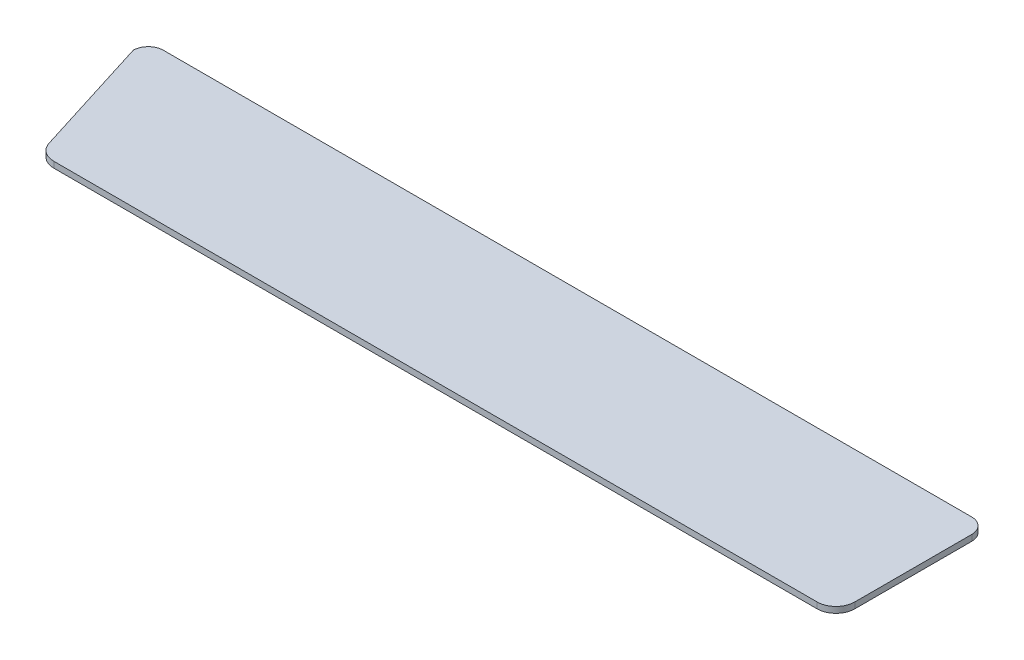
ISO-10303-21;
HEADER;
FILE_DESCRIPTION(('STEP AP214'),'2;1');
FILE_NAME('part.step','',(''),(''),'','','');
FILE_SCHEMA(('AUTOMOTIVE_DESIGN { 1 0 10303 214 1 1 1 1 }'));
ENDSEC;
DATA;
#1=APPLICATION_CONTEXT('core data for automotive mechanical design processes');
#2=APPLICATION_PROTOCOL_DEFINITION('international standard','automotive_design',2000,#1);
#3=PRODUCT_CONTEXT('',#1,'mechanical');
#4=PRODUCT('Part','Part','',(#3));
#5=PRODUCT_RELATED_PRODUCT_CATEGORY('part','',(#4));
#6=PRODUCT_DEFINITION_FORMATION('','',#4);
#7=PRODUCT_DEFINITION_CONTEXT('part definition',#1,'design');
#8=PRODUCT_DEFINITION('design','',#6,#7);
#9=PRODUCT_DEFINITION_SHAPE('','',#8);
#10=(LENGTH_UNIT() NAMED_UNIT(*) SI_UNIT(.MILLI.,.METRE.));
#11=(NAMED_UNIT(*) PLANE_ANGLE_UNIT() SI_UNIT($,.RADIAN.));
#12=(NAMED_UNIT(*) SI_UNIT($,.STERADIAN.) SOLID_ANGLE_UNIT());
#13=UNCERTAINTY_MEASURE_WITH_UNIT(LENGTH_MEASURE(1.E-05),#10,'distance_accuracy_value','');
#14=(GEOMETRIC_REPRESENTATION_CONTEXT(3) GLOBAL_UNCERTAINTY_ASSIGNED_CONTEXT((#13)) GLOBAL_UNIT_ASSIGNED_CONTEXT((#10,
#11,#12)) REPRESENTATION_CONTEXT('',''));
#15=CARTESIAN_POINT('',(0.,0.,0.));
#16=DIRECTION('',(0.,0.,1.));
#17=DIRECTION('',(1.,0.,0.));
#18=AXIS2_PLACEMENT_3D('',#15,#16,#17);
#19=CARTESIAN_POINT('',(444.5,3.175,0.));
#20=DIRECTION('',(-1.,0.,0.));
#21=DIRECTION('',(0.,0.,1.));
#22=AXIS2_PLACEMENT_3D('',#19,#20,#21);
#23=PLANE('',#22);
#24=DIRECTION('',(0.,0.,-1.));
#25=VECTOR('',#24,1.);
#26=CARTESIAN_POINT('',(444.5,3.175,0.));
#27=LINE('',#26,#25);
#28=CARTESIAN_POINT('',(444.5,3.175,-80.));
#29=VERTEX_POINT('',#28);
#30=CARTESIAN_POINT('',(444.5,3.175,-142.));
#31=VERTEX_POINT('',#30);
#32=EDGE_CURVE('E102',#29,#31,#27,.T.);
#33=ORIENTED_EDGE('',*,*,#32,.F.);
#34=DIRECTION('',(0.,1.,0.));
#35=VECTOR('',#34,1.);
#36=CARTESIAN_POINT('',(444.5,0.,-80.));
#37=LINE('',#36,#35);
#38=CARTESIAN_POINT('',(444.5,0.,-80.));
#39=VERTEX_POINT('',#38);
#40=EDGE_CURVE('E50',#29,#39,#37,.F.);
#41=ORIENTED_EDGE('',*,*,#40,.T.);
#42=DIRECTION('',(0.,0.,-1.));
#43=VECTOR('',#42,1.);
#44=CARTESIAN_POINT('',(444.5,0.,0.));
#45=LINE('',#44,#43);
#46=CARTESIAN_POINT('',(444.5,0.,-142.));
#47=VERTEX_POINT('',#46);
#48=EDGE_CURVE('E114',#39,#47,#45,.T.);
#49=ORIENTED_EDGE('',*,*,#48,.T.);
#50=DIRECTION('',(0.,-1.,0.));
#51=VECTOR('',#50,1.);
#52=CARTESIAN_POINT('',(444.5,3.175,-142.));
#53=LINE('',#52,#51);
#54=EDGE_CURVE('E113',#31,#47,#53,.T.);
#55=ORIENTED_EDGE('',*,*,#54,.F.);
#56=EDGE_LOOP('',(#33,#41,#49,#55));
#57=FACE_BOUND('',#56,.T.);
#58=ADVANCED_FACE('F41',(#57),#23,.F.);
#59=CARTESIAN_POINT('',(40.5261663286004,3.175,-12.7022312373225));
#60=DIRECTION('',(0.954226213925607,0.,-0.29908582824534));
#61=DIRECTION('',(-0.29908582824534,0.,-0.954226213925608));
#62=AXIS2_PLACEMENT_3D('',#59,#60,#61);
#63=PLANE('',#62);
#64=DIRECTION('',(0.29908582824534,0.,0.954226213925608));
#65=VECTOR('',#64,1.);
#66=CARTESIAN_POINT('',(40.5261663286004,0.,-12.7022312373225));
#67=LINE('',#66,#65);
#68=CARTESIAN_POINT('',(0.,0.,-142.));
#69=VERTEX_POINT('',#68);
#70=CARTESIAN_POINT('',(20.3702690139033,0.,-77.0091417175466));
#71=VERTEX_POINT('',#70);
#72=EDGE_CURVE('E110',#69,#71,#67,.T.);
#73=ORIENTED_EDGE('',*,*,#72,.T.);
#74=DIRECTION('',(0.,-1.,0.));
#75=VECTOR('',#74,1.);
#76=CARTESIAN_POINT('',(20.3702690139033,3.175,-77.0091417175466));
#77=LINE('',#76,#75);
#78=CARTESIAN_POINT('',(20.3702690139033,3.175,-77.0091417175466));
#79=VERTEX_POINT('',#78);
#80=EDGE_CURVE('E173',#71,#79,#77,.F.);
#81=ORIENTED_EDGE('',*,*,#80,.T.);
#82=DIRECTION('',(0.29908582824534,0.,0.954226213925608));
#83=VECTOR('',#82,1.);
#84=CARTESIAN_POINT('',(40.5261663286004,3.175,-12.7022312373225));
#85=LINE('',#84,#83);
#86=CARTESIAN_POINT('',(0.,3.175,-142.));
#87=VERTEX_POINT('',#86);
#88=EDGE_CURVE('E134',#87,#79,#85,.T.);
#89=ORIENTED_EDGE('',*,*,#88,.F.);
#90=DIRECTION('',(0.,-1.,0.));
#91=VECTOR('',#90,1.);
#92=CARTESIAN_POINT('',(0.,3.175,-142.));
#93=LINE('',#92,#91);
#94=EDGE_CURVE('E138',#87,#69,#93,.T.);
#95=ORIENTED_EDGE('',*,*,#94,.T.);
#96=EDGE_LOOP('',(#73,#81,#89,#95));
#97=FACE_BOUND('',#96,.T.);
#98=ADVANCED_FACE('F207',(#97),#63,.F.);
#99=CARTESIAN_POINT('',(0.,3.175,0.));
#100=DIRECTION('',(0.,1.,0.));
#101=DIRECTION('',(0.,0.,1.));
#102=AXIS2_PLACEMENT_3D('',#99,#100,#101);
#103=PLANE('',#102);
#104=DIRECTION('',(1.,0.,0.));
#105=VECTOR('',#104,1.);
#106=CARTESIAN_POINT('',(0.,3.175,-70.));
#107=LINE('',#106,#105);
#108=CARTESIAN_POINT('',(29.9125311531594,3.175,-70.));
#109=VERTEX_POINT('',#108);
#110=CARTESIAN_POINT('',(434.5,3.175,-70.));
#111=VERTEX_POINT('',#110);
#112=EDGE_CURVE('E142',#109,#111,#107,.T.);
#113=ORIENTED_EDGE('',*,*,#112,.T.);
#114=CARTESIAN_POINT('',(434.5,3.175,-80.));
#115=DIRECTION('',(0.,1.,0.));
#116=DIRECTION('',(0.,0.,1.));
#117=AXIS2_PLACEMENT_3D('',#114,#115,#116);
#118=CIRCLE('',#117,10.);
#119=EDGE_CURVE('E64',#111,#29,#118,.T.);
#120=ORIENTED_EDGE('',*,*,#119,.T.);
#121=ORIENTED_EDGE('',*,*,#32,.T.);
#122=CARTESIAN_POINT('',(436.5,3.175,-142.));
#123=DIRECTION('',(0.,1.,0.));
#124=DIRECTION('',(0.,0.,1.));
#125=AXIS2_PLACEMENT_3D('',#122,#123,#124);
#126=CIRCLE('',#125,7.99999999999999);
#127=CARTESIAN_POINT('',(436.5,3.175,-150.));
#128=VERTEX_POINT('',#127);
#129=EDGE_CURVE('E107',#31,#128,#126,.T.);
#130=ORIENTED_EDGE('',*,*,#129,.T.);
#131=DIRECTION('',(1.,0.,0.));
#132=VECTOR('',#131,1.);
#133=CARTESIAN_POINT('',(0.,3.175,-150.));
#134=LINE('',#133,#132);
#135=CARTESIAN_POINT('',(8.,3.175,-150.));
#136=VERTEX_POINT('',#135);
#137=EDGE_CURVE('E125',#136,#128,#134,.T.);
#138=ORIENTED_EDGE('',*,*,#137,.F.);
#139=CARTESIAN_POINT('',(8.,3.175,-142.));
#140=DIRECTION('',(0.,1.,0.));
#141=DIRECTION('',(0.,0.,1.));
#142=AXIS2_PLACEMENT_3D('',#139,#140,#141);
#143=CIRCLE('',#142,8.);
#144=EDGE_CURVE('E128',#136,#87,#143,.T.);
#145=ORIENTED_EDGE('',*,*,#144,.T.);
#146=ORIENTED_EDGE('',*,*,#88,.T.);
#147=CARTESIAN_POINT('',(29.9125311531594,3.175,-80.));
#148=DIRECTION('',(0.,1.,0.));
#149=DIRECTION('',(0.,0.,1.));
#150=AXIS2_PLACEMENT_3D('',#147,#148,#149);
#151=CIRCLE('',#150,10.);
#152=EDGE_CURVE('E176',#79,#109,#151,.T.);
#153=ORIENTED_EDGE('',*,*,#152,.T.);
#154=EDGE_LOOP('',(#113,#120,#121,#130,#138,#145,#146,#153));
#155=FACE_BOUND('',#154,.T.);
#156=ADVANCED_FACE('F104',(#155),#103,.T.);
#157=CARTESIAN_POINT('',(0.,0.,0.));
#158=DIRECTION('',(0.,1.,0.));
#159=DIRECTION('',(0.,0.,1.));
#160=AXIS2_PLACEMENT_3D('',#157,#158,#159);
#161=PLANE('',#160);
#162=ORIENTED_EDGE('',*,*,#48,.F.);
#163=CARTESIAN_POINT('',(434.5,0.,-80.));
#164=DIRECTION('',(0.,1.,0.));
#165=DIRECTION('',(0.,0.,1.));
#166=AXIS2_PLACEMENT_3D('',#163,#164,#165);
#167=CIRCLE('',#166,10.);
#168=CARTESIAN_POINT('',(434.5,0.,-70.));
#169=VERTEX_POINT('',#168);
#170=EDGE_CURVE('E11',#39,#169,#167,.F.);
#171=ORIENTED_EDGE('',*,*,#170,.T.);
#172=DIRECTION('',(1.,0.,0.));
#173=VECTOR('',#172,1.);
#174=CARTESIAN_POINT('',(0.,0.,-70.));
#175=LINE('',#174,#173);
#176=CARTESIAN_POINT('',(29.9125311531594,0.,-70.));
#177=VERTEX_POINT('',#176);
#178=EDGE_CURVE('E119',#177,#169,#175,.T.);
#179=ORIENTED_EDGE('',*,*,#178,.F.);
#180=CARTESIAN_POINT('',(29.9125311531594,0.,-80.));
#181=DIRECTION('',(0.,1.,0.));
#182=DIRECTION('',(0.,0.,1.));
#183=AXIS2_PLACEMENT_3D('',#180,#181,#182);
#184=CIRCLE('',#183,10.);
#185=EDGE_CURVE('E170',#177,#71,#184,.F.);
#186=ORIENTED_EDGE('',*,*,#185,.T.);
#187=ORIENTED_EDGE('',*,*,#72,.F.);
#188=CARTESIAN_POINT('',(8.,0.,-142.));
#189=DIRECTION('',(0.,1.,0.));
#190=DIRECTION('',(0.,0.,1.));
#191=AXIS2_PLACEMENT_3D('',#188,#189,#190);
#192=CIRCLE('',#191,8.);
#193=CARTESIAN_POINT('',(8.,0.,-150.));
#194=VERTEX_POINT('',#193);
#195=EDGE_CURVE('E149',#194,#69,#192,.T.);
#196=ORIENTED_EDGE('',*,*,#195,.F.);
#197=DIRECTION('',(1.,0.,0.));
#198=VECTOR('',#197,1.);
#199=CARTESIAN_POINT('',(0.,0.,-150.));
#200=LINE('',#199,#198);
#201=CARTESIAN_POINT('',(436.5,0.,-150.));
#202=VERTEX_POINT('',#201);
#203=EDGE_CURVE('E145',#194,#202,#200,.T.);
#204=ORIENTED_EDGE('',*,*,#203,.T.);
#205=CARTESIAN_POINT('',(436.5,0.,-142.));
#206=DIRECTION('',(0.,1.,0.));
#207=DIRECTION('',(0.,0.,1.));
#208=AXIS2_PLACEMENT_3D('',#205,#206,#207);
#209=CIRCLE('',#208,7.99999999999999);
#210=EDGE_CURVE('E141',#47,#202,#209,.T.);
#211=ORIENTED_EDGE('',*,*,#210,.F.);
#212=EDGE_LOOP('',(#162,#171,#179,#186,#187,#196,#204,#211));
#213=FACE_BOUND('',#212,.T.);
#214=ADVANCED_FACE('F200',(#213),#161,.F.);
#215=CARTESIAN_POINT('',(436.5,3.175,-142.));
#216=DIRECTION('',(0.,-1.,0.));
#217=DIRECTION('',(0.,0.,-1.));
#218=AXIS2_PLACEMENT_3D('',#215,#216,#217);
#219=CYLINDRICAL_SURFACE('',#218,7.99999999999999);
#220=ORIENTED_EDGE('',*,*,#210,.T.);
#221=DIRECTION('',(0.,-1.,0.));
#222=VECTOR('',#221,1.);
#223=CARTESIAN_POINT('',(436.5,3.175,-150.));
#224=LINE('',#223,#222);
#225=EDGE_CURVE('E120',#128,#202,#224,.T.);
#226=ORIENTED_EDGE('',*,*,#225,.F.);
#227=ORIENTED_EDGE('',*,*,#129,.F.);
#228=ORIENTED_EDGE('',*,*,#54,.T.);
#229=EDGE_LOOP('',(#220,#226,#227,#228));
#230=FACE_BOUND('',#229,.T.);
#231=ADVANCED_FACE('F122',(#230),#219,.T.);
#232=CARTESIAN_POINT('',(0.,3.175,-150.));
#233=DIRECTION('',(0.,0.,-1.));
#234=DIRECTION('',(-1.,0.,0.));
#235=AXIS2_PLACEMENT_3D('',#232,#233,#234);
#236=PLANE('',#235);
#237=ORIENTED_EDGE('',*,*,#203,.F.);
#238=DIRECTION('',(0.,-1.,0.));
#239=VECTOR('',#238,1.);
#240=CARTESIAN_POINT('',(8.,3.175,-150.));
#241=LINE('',#240,#239);
#242=EDGE_CURVE('E158',#136,#194,#241,.T.);
#243=ORIENTED_EDGE('',*,*,#242,.F.);
#244=ORIENTED_EDGE('',*,*,#137,.T.);
#245=ORIENTED_EDGE('',*,*,#225,.T.);
#246=EDGE_LOOP('',(#237,#243,#244,#245));
#247=FACE_BOUND('',#246,.T.);
#248=ADVANCED_FACE('F217',(#247),#236,.T.);
#249=CARTESIAN_POINT('',(8.,3.175,-142.));
#250=DIRECTION('',(0.,-1.,0.));
#251=DIRECTION('',(0.,0.,-1.));
#252=AXIS2_PLACEMENT_3D('',#249,#250,#251);
#253=CYLINDRICAL_SURFACE('',#252,8.);
#254=ORIENTED_EDGE('',*,*,#195,.T.);
#255=ORIENTED_EDGE('',*,*,#94,.F.);
#256=ORIENTED_EDGE('',*,*,#144,.F.);
#257=ORIENTED_EDGE('',*,*,#242,.T.);
#258=EDGE_LOOP('',(#254,#255,#256,#257));
#259=FACE_BOUND('',#258,.T.);
#260=ADVANCED_FACE('F220',(#259),#253,.T.);
#261=CARTESIAN_POINT('',(0.,0.,-70.));
#262=DIRECTION('',(0.,0.,1.));
#263=DIRECTION('',(1.,0.,0.));
#264=AXIS2_PLACEMENT_3D('',#261,#262,#263);
#265=PLANE('',#264);
#266=ORIENTED_EDGE('',*,*,#178,.T.);
#267=DIRECTION('',(0.,1.,0.));
#268=VECTOR('',#267,1.);
#269=CARTESIAN_POINT('',(434.5,3.175,-70.));
#270=LINE('',#269,#268);
#271=EDGE_CURVE('E179',#169,#111,#270,.T.);
#272=ORIENTED_EDGE('',*,*,#271,.T.);
#273=ORIENTED_EDGE('',*,*,#112,.F.);
#274=DIRECTION('',(0.,-1.,0.));
#275=VECTOR('',#274,1.);
#276=CARTESIAN_POINT('',(29.9125311531594,0.,-70.));
#277=LINE('',#276,#275);
#278=EDGE_CURVE('E166',#109,#177,#277,.T.);
#279=ORIENTED_EDGE('',*,*,#278,.T.);
#280=EDGE_LOOP('',(#266,#272,#273,#279));
#281=FACE_BOUND('',#280,.T.);
#282=ADVANCED_FACE('F188',(#281),#265,.T.);
#283=CARTESIAN_POINT('',(29.9125311531594,0.,-80.));
#284=DIRECTION('',(0.,1.,0.));
#285=DIRECTION('',(0.,0.,1.));
#286=AXIS2_PLACEMENT_3D('',#283,#284,#285);
#287=CYLINDRICAL_SURFACE('',#286,10.);
#288=ORIENTED_EDGE('',*,*,#152,.F.);
#289=ORIENTED_EDGE('',*,*,#80,.F.);
#290=ORIENTED_EDGE('',*,*,#185,.F.);
#291=ORIENTED_EDGE('',*,*,#278,.F.);
#292=EDGE_LOOP('',(#288,#289,#290,#291));
#293=FACE_BOUND('',#292,.T.);
#294=ADVANCED_FACE('F198',(#293),#287,.T.);
#295=CARTESIAN_POINT('',(434.5,0.,-80.));
#296=DIRECTION('',(0.,-1.,0.));
#297=DIRECTION('',(0.,0.,-1.));
#298=AXIS2_PLACEMENT_3D('',#295,#296,#297);
#299=CYLINDRICAL_SURFACE('',#298,10.);
#300=ORIENTED_EDGE('',*,*,#170,.F.);
#301=ORIENTED_EDGE('',*,*,#40,.F.);
#302=ORIENTED_EDGE('',*,*,#119,.F.);
#303=ORIENTED_EDGE('',*,*,#271,.F.);
#304=EDGE_LOOP('',(#300,#301,#302,#303));
#305=FACE_BOUND('',#304,.T.);
#306=ADVANCED_FACE('F43',(#305),#299,.T.);
#307=CLOSED_SHELL('',(#58,#98,#156,#214,#231,#248,#260,#282,#294,#306));
#308=MANIFOLD_SOLID_BREP('B2',#307);
#309=ADVANCED_BREP_SHAPE_REPRESENTATION('',(#18,#308),#14);
#310=SHAPE_DEFINITION_REPRESENTATION(#9,#309);
ENDSEC;
END-ISO-10303-21;
